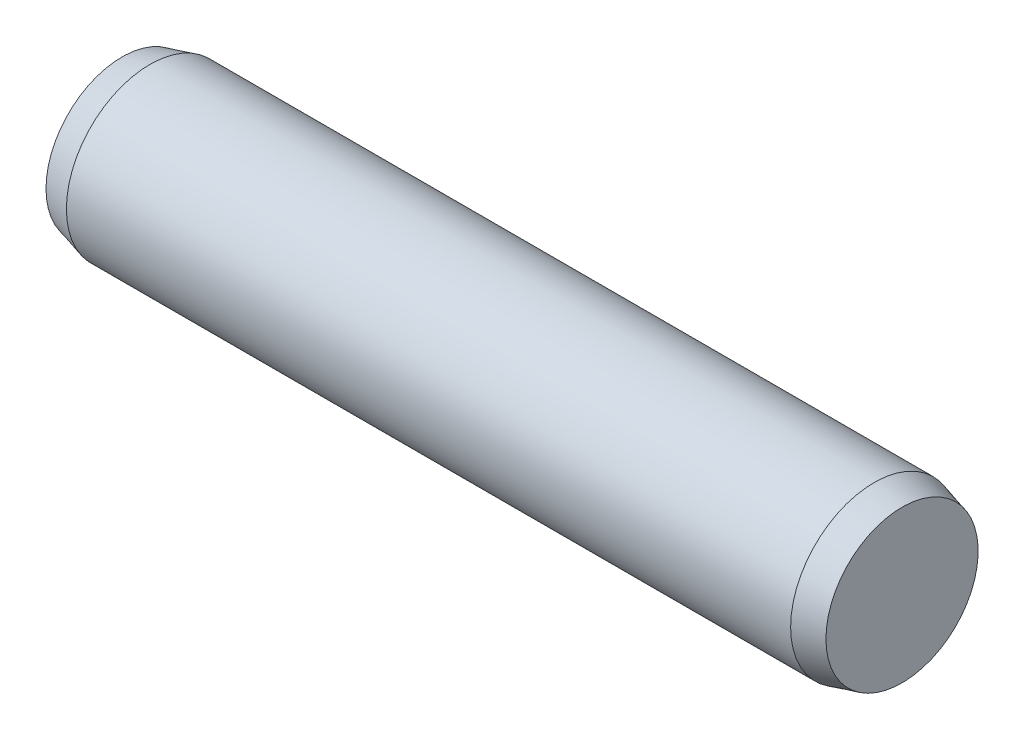
ISO-10303-21;
HEADER;
FILE_DESCRIPTION(('STEP AP214'),'2;1');
FILE_NAME('part.step','',(''),(''),'','','');
FILE_SCHEMA(('AUTOMOTIVE_DESIGN { 1 0 10303 214 1 1 1 1 }'));
ENDSEC;
DATA;
#1=APPLICATION_CONTEXT('core data for automotive mechanical design processes');
#2=APPLICATION_PROTOCOL_DEFINITION('international standard','automotive_design',2000,#1);
#3=PRODUCT_CONTEXT('',#1,'mechanical');
#4=PRODUCT('Part','Part','',(#3));
#5=PRODUCT_RELATED_PRODUCT_CATEGORY('part','',(#4));
#6=PRODUCT_DEFINITION_FORMATION('','',#4);
#7=PRODUCT_DEFINITION_CONTEXT('part definition',#1,'design');
#8=PRODUCT_DEFINITION('design','',#6,#7);
#9=PRODUCT_DEFINITION_SHAPE('','',#8);
#10=(LENGTH_UNIT() NAMED_UNIT(*) SI_UNIT(.MILLI.,.METRE.));
#11=(NAMED_UNIT(*) PLANE_ANGLE_UNIT() SI_UNIT($,.RADIAN.));
#12=(NAMED_UNIT(*) SI_UNIT($,.STERADIAN.) SOLID_ANGLE_UNIT());
#13=UNCERTAINTY_MEASURE_WITH_UNIT(LENGTH_MEASURE(1.E-05),#10,'distance_accuracy_value','');
#14=(GEOMETRIC_REPRESENTATION_CONTEXT(3) GLOBAL_UNCERTAINTY_ASSIGNED_CONTEXT((#13)) GLOBAL_UNIT_ASSIGNED_CONTEXT((#10,
#11,#12)) REPRESENTATION_CONTEXT('',''));
#15=CARTESIAN_POINT('',(0.,0.,0.));
#16=DIRECTION('',(0.,0.,1.));
#17=DIRECTION('',(1.,0.,0.));
#18=AXIS2_PLACEMENT_3D('',#15,#16,#17);
#19=CARTESIAN_POINT('',(0.,1.36602540378444,0.));
#20=DIRECTION('',(1.,0.,0.));
#21=DIRECTION('',(0.,0.,-1.));
#22=AXIS2_PLACEMENT_3D('',#19,#20,#21);
#23=PLANE('',#22);
#24=CARTESIAN_POINT('',(0.,0.,0.));
#25=DIRECTION('',(-1.,0.,0.));
#26=DIRECTION('',(0.,0.,1.));
#27=AXIS2_PLACEMENT_3D('',#24,#25,#26);
#28=CIRCLE('',#27,1.36602540378444);
#29=CARTESIAN_POINT('',(0.,0.,1.36602540378444));
#30=VERTEX_POINT('',#29);
#31=EDGE_CURVE('E10',#30,#30,#28,.T.);
#32=ORIENTED_EDGE('',*,*,#31,.T.);
#33=EDGE_LOOP('',(#32));
#34=FACE_BOUND('',#33,.T.);
#35=ADVANCED_FACE('F31',(#34),#23,.F.);
#36=CARTESIAN_POINT('',(0.5,0.,0.));
#37=DIRECTION('',(1.,0.,0.));
#38=DIRECTION('',(0.,0.,-1.));
#39=AXIS2_PLACEMENT_3D('',#36,#37,#38);
#40=CONICAL_SURFACE('',#39,1.5,0.261799387799151);
#41=ORIENTED_EDGE('',*,*,#31,.F.);
#42=EDGE_LOOP('',(#41));
#43=FACE_BOUND('',#42,.T.);
#44=CARTESIAN_POINT('',(0.5,0.,0.));
#45=DIRECTION('',(-1.,0.,0.));
#46=DIRECTION('',(0.,0.,1.));
#47=AXIS2_PLACEMENT_3D('',#44,#45,#46);
#48=CIRCLE('',#47,1.5);
#49=CARTESIAN_POINT('',(0.5,0.,1.5));
#50=VERTEX_POINT('',#49);
#51=EDGE_CURVE('E37',#50,#50,#48,.T.);
#52=ORIENTED_EDGE('',*,*,#51,.T.);
#53=EDGE_LOOP('',(#52));
#54=FACE_BOUND('',#53,.T.);
#55=ADVANCED_FACE('F63',(#43,#54),#40,.T.);
#56=CARTESIAN_POINT('',(-1.65571726559622,0.,0.));
#57=DIRECTION('',(-1.,0.,0.));
#58=DIRECTION('',(0.,0.,1.));
#59=AXIS2_PLACEMENT_3D('',#56,#57,#58);
#60=CYLINDRICAL_SURFACE('',#59,1.5);
#61=ORIENTED_EDGE('',*,*,#51,.F.);
#62=EDGE_LOOP('',(#61));
#63=FACE_BOUND('',#62,.T.);
#64=CARTESIAN_POINT('',(13.5,0.,0.));
#65=DIRECTION('',(-1.,0.,0.));
#66=DIRECTION('',(0.,0.,1.));
#67=AXIS2_PLACEMENT_3D('',#64,#65,#66);
#68=CIRCLE('',#67,1.5);
#69=CARTESIAN_POINT('',(13.5,0.,1.5));
#70=VERTEX_POINT('',#69);
#71=EDGE_CURVE('E41',#70,#70,#68,.T.);
#72=ORIENTED_EDGE('',*,*,#71,.T.);
#73=EDGE_LOOP('',(#72));
#74=FACE_BOUND('',#73,.T.);
#75=ADVANCED_FACE('F59',(#63,#74),#60,.T.);
#76=CARTESIAN_POINT('',(14.,0.,0.));
#77=DIRECTION('',(-1.,0.,0.));
#78=DIRECTION('',(0.,0.,1.));
#79=AXIS2_PLACEMENT_3D('',#76,#77,#78);
#80=CONICAL_SURFACE('',#79,1.36602540378444,0.261799387799149);
#81=ORIENTED_EDGE('',*,*,#71,.F.);
#82=EDGE_LOOP('',(#81));
#83=FACE_BOUND('',#82,.T.);
#84=CARTESIAN_POINT('',(14.,0.,0.));
#85=DIRECTION('',(-1.,0.,0.));
#86=DIRECTION('',(0.,0.,1.));
#87=AXIS2_PLACEMENT_3D('',#84,#85,#86);
#88=CIRCLE('',#87,1.36602540378444);
#89=CARTESIAN_POINT('',(14.,0.,1.36602540378444));
#90=VERTEX_POINT('',#89);
#91=EDGE_CURVE('E45',#90,#90,#88,.T.);
#92=ORIENTED_EDGE('',*,*,#91,.T.);
#93=EDGE_LOOP('',(#92));
#94=FACE_BOUND('',#93,.T.);
#95=ADVANCED_FACE('F51',(#83,#94),#80,.T.);
#96=CARTESIAN_POINT('',(14.,0.,0.));
#97=DIRECTION('',(-1.,0.,0.));
#98=DIRECTION('',(0.,0.,1.));
#99=AXIS2_PLACEMENT_3D('',#96,#97,#98);
#100=PLANE('',#99);
#101=ORIENTED_EDGE('',*,*,#91,.F.);
#102=EDGE_LOOP('',(#101));
#103=FACE_BOUND('',#102,.T.);
#104=ADVANCED_FACE('F53',(#103),#100,.F.);
#105=CLOSED_SHELL('',(#35,#55,#75,#95,#104));
#106=MANIFOLD_SOLID_BREP('B2',#105);
#107=ADVANCED_BREP_SHAPE_REPRESENTATION('',(#18,#106),#14);
#108=SHAPE_DEFINITION_REPRESENTATION(#9,#107);
ENDSEC;
END-ISO-10303-21;
